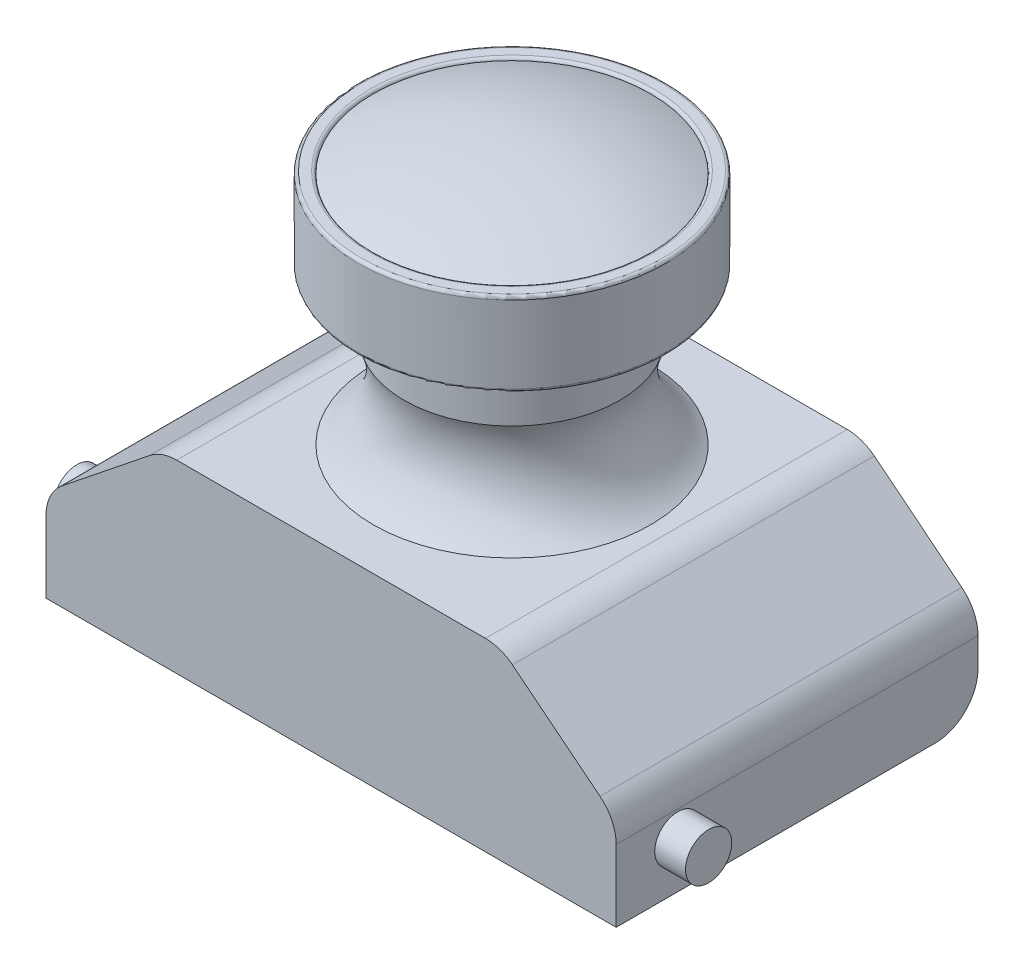
ISO-10303-21;
HEADER;
FILE_DESCRIPTION(('STEP AP214'),'2;1');
FILE_NAME('part.step','',(''),(''),'','','');
FILE_SCHEMA(('AUTOMOTIVE_DESIGN { 1 0 10303 214 1 1 1 1 }'));
ENDSEC;
DATA;
#1=APPLICATION_CONTEXT('core data for automotive mechanical design processes');
#2=APPLICATION_PROTOCOL_DEFINITION('international standard','automotive_design',2000,#1);
#3=PRODUCT_CONTEXT('',#1,'mechanical');
#4=PRODUCT('Part','Part','',(#3));
#5=PRODUCT_RELATED_PRODUCT_CATEGORY('part','',(#4));
#6=PRODUCT_DEFINITION_FORMATION('','',#4);
#7=PRODUCT_DEFINITION_CONTEXT('part definition',#1,'design');
#8=PRODUCT_DEFINITION('design','',#6,#7);
#9=PRODUCT_DEFINITION_SHAPE('','',#8);
#10=(LENGTH_UNIT() NAMED_UNIT(*) SI_UNIT(.MILLI.,.METRE.));
#11=(NAMED_UNIT(*) PLANE_ANGLE_UNIT() SI_UNIT($,.RADIAN.));
#12=(NAMED_UNIT(*) SI_UNIT($,.STERADIAN.) SOLID_ANGLE_UNIT());
#13=UNCERTAINTY_MEASURE_WITH_UNIT(LENGTH_MEASURE(1.E-05),#10,'distance_accuracy_value','');
#14=(GEOMETRIC_REPRESENTATION_CONTEXT(3) GLOBAL_UNCERTAINTY_ASSIGNED_CONTEXT((#13)) GLOBAL_UNIT_ASSIGNED_CONTEXT((#10,
#11,#12)) REPRESENTATION_CONTEXT('',''));
#15=CARTESIAN_POINT('',(0.,0.,0.));
#16=DIRECTION('',(0.,0.,1.));
#17=DIRECTION('',(1.,0.,0.));
#18=AXIS2_PLACEMENT_3D('',#15,#16,#17);
#19=CARTESIAN_POINT('',(-9.25,3.,5.87));
#20=DIRECTION('',(1.,0.,0.));
#21=DIRECTION('',(0.,0.,-1.));
#22=AXIS2_PLACEMENT_3D('',#19,#20,#21);
#23=PLANE('',#22);
#24=CARTESIAN_POINT('',(-9.25,1.5,3.87));
#25=DIRECTION('',(1.,0.,0.));
#26=DIRECTION('',(0.,0.,-1.));
#27=AXIS2_PLACEMENT_3D('',#24,#25,#26);
#28=CIRCLE('',#27,0.75);
#29=CARTESIAN_POINT('',(-9.25,1.5,3.12));
#30=VERTEX_POINT('',#29);
#31=EDGE_CURVE('E182',#30,#30,#28,.F.);
#32=ORIENTED_EDGE('',*,*,#31,.F.);
#33=EDGE_LOOP('',(#32));
#34=FACE_BOUND('',#33,.T.);
#35=DIRECTION('',(0.,-1.,0.));
#36=VECTOR('',#35,1.);
#37=CARTESIAN_POINT('',(-9.25,3.,-5.87));
#38=LINE('',#37,#36);
#39=CARTESIAN_POINT('',(-9.25,2.3271252135188,-5.87));
#40=VERTEX_POINT('',#39);
#41=CARTESIAN_POINT('',(-9.25,1.4,-5.87));
#42=VERTEX_POINT('',#41);
#43=EDGE_CURVE('E274',#40,#42,#38,.T.);
#44=ORIENTED_EDGE('',*,*,#43,.T.);
#45=CARTESIAN_POINT('',(-9.25,1.4,-4.47));
#46=DIRECTION('',(1.,0.,0.));
#47=DIRECTION('',(0.,0.,-1.));
#48=AXIS2_PLACEMENT_3D('',#45,#46,#47);
#49=CIRCLE('',#48,1.4);
#50=CARTESIAN_POINT('',(-9.25,0.,-4.47));
#51=VERTEX_POINT('',#50);
#52=EDGE_CURVE('E160',#42,#51,#49,.F.);
#53=ORIENTED_EDGE('',*,*,#52,.T.);
#54=DIRECTION('',(0.,0.,-1.));
#55=VECTOR('',#54,1.);
#56=CARTESIAN_POINT('',(-9.25,0.,5.87));
#57=LINE('',#56,#55);
#58=CARTESIAN_POINT('',(-9.25,0.,5.87));
#59=VERTEX_POINT('',#58);
#60=EDGE_CURVE('E150',#59,#51,#57,.T.);
#61=ORIENTED_EDGE('',*,*,#60,.F.);
#62=DIRECTION('',(0.,-1.,0.));
#63=VECTOR('',#62,1.);
#64=CARTESIAN_POINT('',(-9.25,3.,5.87));
#65=LINE('',#64,#63);
#66=CARTESIAN_POINT('',(-9.25,2.3271252135188,5.87));
#67=VERTEX_POINT('',#66);
#68=EDGE_CURVE('E130',#67,#59,#65,.T.);
#69=ORIENTED_EDGE('',*,*,#68,.F.);
#70=DIRECTION('',(0.,0.,-1.));
#71=VECTOR('',#70,1.);
#72=CARTESIAN_POINT('',(-9.25,2.3271252135188,5.87));
#73=LINE('',#72,#71);
#74=EDGE_CURVE('E225',#67,#40,#73,.T.);
#75=ORIENTED_EDGE('',*,*,#74,.T.);
#76=EDGE_LOOP('',(#44,#53,#61,#69,#75));
#77=FACE_BOUND('',#76,.T.);
#78=ADVANCED_FACE('F47',(#34,#77),#23,.F.);
#79=CARTESIAN_POINT('',(-9.25,0.,5.87));
#80=DIRECTION('',(0.,1.,0.));
#81=DIRECTION('',(0.,0.,1.));
#82=AXIS2_PLACEMENT_3D('',#79,#80,#81);
#83=PLANE('',#82);
#84=ORIENTED_EDGE('',*,*,#60,.T.);
#85=DIRECTION('',(1.,0.,0.));
#86=VECTOR('',#85,1.);
#87=CARTESIAN_POINT('',(-9.25,0.,-4.47));
#88=LINE('',#87,#86);
#89=CARTESIAN_POINT('',(9.25,0.,-4.47));
#90=VERTEX_POINT('',#89);
#91=EDGE_CURVE('E203',#51,#90,#88,.T.);
#92=ORIENTED_EDGE('',*,*,#91,.T.);
#93=DIRECTION('',(0.,0.,-1.));
#94=VECTOR('',#93,1.);
#95=CARTESIAN_POINT('',(9.25,0.,5.87));
#96=LINE('',#95,#94);
#97=CARTESIAN_POINT('',(9.25,0.,5.87));
#98=VERTEX_POINT('',#97);
#99=EDGE_CURVE('E153',#98,#90,#96,.T.);
#100=ORIENTED_EDGE('',*,*,#99,.F.);
#101=DIRECTION('',(1.,0.,0.));
#102=VECTOR('',#101,1.);
#103=CARTESIAN_POINT('',(-9.25,0.,5.87));
#104=LINE('',#103,#102);
#105=EDGE_CURVE('E134',#59,#98,#104,.T.);
#106=ORIENTED_EDGE('',*,*,#105,.F.);
#107=EDGE_LOOP('',(#84,#92,#100,#106));
#108=FACE_BOUND('',#107,.T.);
#109=ADVANCED_FACE('F148',(#108),#83,.F.);
#110=CARTESIAN_POINT('',(9.25,0.,5.87));
#111=DIRECTION('',(-1.,0.,0.));
#112=DIRECTION('',(0.,0.,1.));
#113=AXIS2_PLACEMENT_3D('',#110,#111,#112);
#114=PLANE('',#113);
#115=CARTESIAN_POINT('',(9.25,1.5,3.87));
#116=DIRECTION('',(-1.,0.,0.));
#117=DIRECTION('',(0.,0.,1.));
#118=AXIS2_PLACEMENT_3D('',#115,#116,#117);
#119=CIRCLE('',#118,0.75);
#120=CARTESIAN_POINT('',(9.25,1.5,4.62));
#121=VERTEX_POINT('',#120);
#122=EDGE_CURVE('E167',#121,#121,#119,.F.);
#123=ORIENTED_EDGE('',*,*,#122,.F.);
#124=EDGE_LOOP('',(#123));
#125=FACE_BOUND('',#124,.T.);
#126=ORIENTED_EDGE('',*,*,#99,.T.);
#127=CARTESIAN_POINT('',(9.25,1.4,-4.47));
#128=DIRECTION('',(-1.,0.,0.));
#129=DIRECTION('',(0.,0.,1.));
#130=AXIS2_PLACEMENT_3D('',#127,#128,#129);
#131=CIRCLE('',#130,1.4);
#132=CARTESIAN_POINT('',(9.25,1.4,-5.87));
#133=VERTEX_POINT('',#132);
#134=EDGE_CURVE('E209',#90,#133,#131,.F.);
#135=ORIENTED_EDGE('',*,*,#134,.T.);
#136=DIRECTION('',(0.,1.,0.));
#137=VECTOR('',#136,1.);
#138=CARTESIAN_POINT('',(9.25,0.,-5.87));
#139=LINE('',#138,#137);
#140=CARTESIAN_POINT('',(9.25,2.3271252135188,-5.87));
#141=VERTEX_POINT('',#140);
#142=EDGE_CURVE('E288',#133,#141,#139,.T.);
#143=ORIENTED_EDGE('',*,*,#142,.T.);
#144=DIRECTION('',(0.,0.,-1.));
#145=VECTOR('',#144,1.);
#146=CARTESIAN_POINT('',(9.25,2.3271252135188,5.87));
#147=LINE('',#146,#145);
#148=CARTESIAN_POINT('',(9.25,2.3271252135188,5.87));
#149=VERTEX_POINT('',#148);
#150=EDGE_CURVE('E206',#141,#149,#147,.F.);
#151=ORIENTED_EDGE('',*,*,#150,.T.);
#152=DIRECTION('',(0.,1.,0.));
#153=VECTOR('',#152,1.);
#154=CARTESIAN_POINT('',(9.25,0.,5.87));
#155=LINE('',#154,#153);
#156=EDGE_CURVE('E156',#98,#149,#155,.T.);
#157=ORIENTED_EDGE('',*,*,#156,.F.);
#158=EDGE_LOOP('',(#126,#135,#143,#151,#157));
#159=FACE_BOUND('',#158,.T.);
#160=ADVANCED_FACE('F314',(#125,#159),#114,.F.);
#161=CARTESIAN_POINT('',(9.25,3.,5.87));
#162=DIRECTION('',(-0.624695047554424,-0.78086880944303,0.));
#163=DIRECTION('',(0.78086880944303,-0.624695047554424,0.));
#164=AXIS2_PLACEMENT_3D('',#161,#162,#163);
#165=PLANE('',#164);
#166=DIRECTION('',(-0.78086880944303,0.624695047554424,0.));
#167=VECTOR('',#166,1.);
#168=CARTESIAN_POINT('',(9.25,3.,-5.87));
#169=LINE('',#168,#167);
#170=CARTESIAN_POINT('',(8.72457306657619,3.42034154673904,-5.87));
#171=VERTEX_POINT('',#170);
#172=CARTESIAN_POINT('',(5.8834795834747,5.69321633322024,-5.87));
#173=VERTEX_POINT('',#172);
#174=EDGE_CURVE('E292',#171,#173,#169,.T.);
#175=ORIENTED_EDGE('',*,*,#174,.T.);
#176=DIRECTION('',(0.,0.,-1.));
#177=VECTOR('',#176,1.);
#178=CARTESIAN_POINT('',(5.8834795834747,5.69321633322024,5.87));
#179=LINE('',#178,#177);
#180=CARTESIAN_POINT('',(5.8834795834747,5.69321633322024,5.87));
#181=VERTEX_POINT('',#180);
#182=EDGE_CURVE('E56',#173,#181,#179,.F.);
#183=ORIENTED_EDGE('',*,*,#182,.T.);
#184=DIRECTION('',(-0.78086880944303,0.624695047554424,0.));
#185=VECTOR('',#184,1.);
#186=CARTESIAN_POINT('',(9.25,3.,5.87));
#187=LINE('',#186,#185);
#188=CARTESIAN_POINT('',(8.72457306657619,3.42034154673904,5.87));
#189=VERTEX_POINT('',#188);
#190=EDGE_CURVE('E278',#189,#181,#187,.T.);
#191=ORIENTED_EDGE('',*,*,#190,.F.);
#192=DIRECTION('',(0.,0.,-1.));
#193=VECTOR('',#192,1.);
#194=CARTESIAN_POINT('',(8.72457306657619,3.42034154673905,5.87));
#195=LINE('',#194,#193);
#196=EDGE_CURVE('E230',#189,#171,#195,.T.);
#197=ORIENTED_EDGE('',*,*,#196,.T.);
#198=EDGE_LOOP('',(#175,#183,#191,#197));
#199=FACE_BOUND('',#198,.T.);
#200=ADVANCED_FACE('F320',(#199),#165,.F.);
#201=CARTESIAN_POINT('',(5.5,6.,5.87));
#202=DIRECTION('',(0.,-1.,0.));
#203=DIRECTION('',(0.,0.,-1.));
#204=AXIS2_PLACEMENT_3D('',#201,#202,#203);
#205=PLANE('',#204);
#206=CARTESIAN_POINT('',(0.,6.,0.));
#207=DIRECTION('',(0.,1.,0.));
#208=DIRECTION('',(0.,0.,1.));
#209=AXIS2_PLACEMENT_3D('',#206,#207,#208);
#210=CIRCLE('',#209,4.5);
#211=CARTESIAN_POINT('',(0.,6.,4.5));
#212=VERTEX_POINT('',#211);
#213=EDGE_CURVE('E162',#212,#212,#210,.T.);
#214=ORIENTED_EDGE('',*,*,#213,.F.);
#215=EDGE_LOOP('',(#214));
#216=FACE_BOUND('',#215,.T.);
#217=DIRECTION('',(-1.,0.,0.));
#218=VECTOR('',#217,1.);
#219=CARTESIAN_POINT('',(5.5,6.,5.87));
#220=LINE('',#219,#218);
#221=CARTESIAN_POINT('',(5.0089065168985,6.,5.87));
#222=VERTEX_POINT('',#221);
#223=CARTESIAN_POINT('',(-5.0089065168985,6.,5.87));
#224=VERTEX_POINT('',#223);
#225=EDGE_CURVE('E281',#222,#224,#220,.T.);
#226=ORIENTED_EDGE('',*,*,#225,.F.);
#227=DIRECTION('',(0.,0.,-1.));
#228=VECTOR('',#227,1.);
#229=CARTESIAN_POINT('',(5.0089065168985,6.,5.87));
#230=LINE('',#229,#228);
#231=CARTESIAN_POINT('',(5.0089065168985,6.,-5.87));
#232=VERTEX_POINT('',#231);
#233=EDGE_CURVE('E253',#222,#232,#230,.T.);
#234=ORIENTED_EDGE('',*,*,#233,.T.);
#235=DIRECTION('',(-1.,0.,0.));
#236=VECTOR('',#235,1.);
#237=CARTESIAN_POINT('',(5.5,6.,-5.87));
#238=LINE('',#237,#236);
#239=CARTESIAN_POINT('',(-5.0089065168985,6.,-5.87));
#240=VERTEX_POINT('',#239);
#241=EDGE_CURVE('E295',#232,#240,#238,.T.);
#242=ORIENTED_EDGE('',*,*,#241,.T.);
#243=DIRECTION('',(0.,0.,-1.));
#244=VECTOR('',#243,1.);
#245=CARTESIAN_POINT('',(-5.0089065168985,6.,5.87));
#246=LINE('',#245,#244);
#247=EDGE_CURVE('E249',#240,#224,#246,.F.);
#248=ORIENTED_EDGE('',*,*,#247,.T.);
#249=EDGE_LOOP('',(#226,#234,#242,#248));
#250=FACE_BOUND('',#249,.T.);
#251=ADVANCED_FACE('F326',(#216,#250),#205,.F.);
#252=CARTESIAN_POINT('',(-5.5,6.,5.87));
#253=DIRECTION('',(0.624695047554424,-0.78086880944303,0.));
#254=DIRECTION('',(0.78086880944303,0.624695047554424,0.));
#255=AXIS2_PLACEMENT_3D('',#252,#253,#254);
#256=PLANE('',#255);
#257=DIRECTION('',(-0.78086880944303,-0.624695047554424,0.));
#258=VECTOR('',#257,1.);
#259=CARTESIAN_POINT('',(-5.5,6.,-5.87));
#260=LINE('',#259,#258);
#261=CARTESIAN_POINT('',(-5.8834795834747,5.69321633322024,-5.87));
#262=VERTEX_POINT('',#261);
#263=CARTESIAN_POINT('',(-8.72457306657619,3.42034154673905,-5.87));
#264=VERTEX_POINT('',#263);
#265=EDGE_CURVE('E144',#262,#264,#260,.T.);
#266=ORIENTED_EDGE('',*,*,#265,.T.);
#267=DIRECTION('',(0.,0.,-1.));
#268=VECTOR('',#267,1.);
#269=CARTESIAN_POINT('',(-8.72457306657619,3.42034154673905,5.87));
#270=LINE('',#269,#268);
#271=CARTESIAN_POINT('',(-8.72457306657619,3.42034154673905,5.87));
#272=VERTEX_POINT('',#271);
#273=EDGE_CURVE('E246',#264,#272,#270,.F.);
#274=ORIENTED_EDGE('',*,*,#273,.T.);
#275=DIRECTION('',(-0.78086880944303,-0.624695047554424,0.));
#276=VECTOR('',#275,1.);
#277=CARTESIAN_POINT('',(-5.5,6.,5.87));
#278=LINE('',#277,#276);
#279=CARTESIAN_POINT('',(-5.8834795834747,5.69321633322024,5.87));
#280=VERTEX_POINT('',#279);
#281=EDGE_CURVE('E169',#280,#272,#278,.T.);
#282=ORIENTED_EDGE('',*,*,#281,.F.);
#283=DIRECTION('',(0.,0.,-1.));
#284=VECTOR('',#283,1.);
#285=CARTESIAN_POINT('',(-5.8834795834747,5.69321633322024,5.87));
#286=LINE('',#285,#284);
#287=EDGE_CURVE('E242',#280,#262,#286,.T.);
#288=ORIENTED_EDGE('',*,*,#287,.T.);
#289=EDGE_LOOP('',(#266,#274,#282,#288));
#290=FACE_BOUND('',#289,.T.);
#291=ADVANCED_FACE('F302',(#290),#256,.F.);
#292=CARTESIAN_POINT('',(0.,0.,5.87));
#293=DIRECTION('',(0.,0.,1.));
#294=DIRECTION('',(1.,0.,0.));
#295=AXIS2_PLACEMENT_3D('',#292,#293,#294);
#296=PLANE('',#295);
#297=ORIENTED_EDGE('',*,*,#190,.T.);
#298=CARTESIAN_POINT('',(5.0089065168985,4.6,5.87));
#299=DIRECTION('',(0.,0.,1.));
#300=DIRECTION('',(1.,0.,0.));
#301=AXIS2_PLACEMENT_3D('',#298,#299,#300);
#302=CIRCLE('',#301,1.4);
#303=EDGE_CURVE('E11',#181,#222,#302,.T.);
#304=ORIENTED_EDGE('',*,*,#303,.T.);
#305=ORIENTED_EDGE('',*,*,#225,.T.);
#306=CARTESIAN_POINT('',(-5.0089065168985,4.6,5.87));
#307=DIRECTION('',(0.,0.,1.));
#308=DIRECTION('',(1.,0.,0.));
#309=AXIS2_PLACEMENT_3D('',#306,#307,#308);
#310=CIRCLE('',#309,1.4);
#311=EDGE_CURVE('E234',#224,#280,#310,.T.);
#312=ORIENTED_EDGE('',*,*,#311,.T.);
#313=ORIENTED_EDGE('',*,*,#281,.T.);
#314=CARTESIAN_POINT('',(-7.85,2.3271252135188,5.87));
#315=DIRECTION('',(0.,0.,1.));
#316=DIRECTION('',(1.,0.,0.));
#317=AXIS2_PLACEMENT_3D('',#314,#315,#316);
#318=CIRCLE('',#317,1.4);
#319=EDGE_CURVE('E138',#272,#67,#318,.T.);
#320=ORIENTED_EDGE('',*,*,#319,.T.);
#321=ORIENTED_EDGE('',*,*,#68,.T.);
#322=ORIENTED_EDGE('',*,*,#105,.T.);
#323=ORIENTED_EDGE('',*,*,#156,.T.);
#324=CARTESIAN_POINT('',(7.85,2.3271252135188,5.87));
#325=DIRECTION('',(0.,0.,1.));
#326=DIRECTION('',(1.,0.,0.));
#327=AXIS2_PLACEMENT_3D('',#324,#325,#326);
#328=CIRCLE('',#327,1.4);
#329=EDGE_CURVE('E239',#149,#189,#328,.T.);
#330=ORIENTED_EDGE('',*,*,#329,.T.);
#331=EDGE_LOOP('',(#297,#304,#305,#312,#313,#320,#321,#322,#323,#330));
#332=FACE_BOUND('',#331,.T.);
#333=ADVANCED_FACE('F132',(#332),#296,.T.);
#334=CARTESIAN_POINT('',(0.,0.,-5.87));
#335=DIRECTION('',(0.,0.,1.));
#336=DIRECTION('',(1.,0.,0.));
#337=AXIS2_PLACEMENT_3D('',#334,#335,#336);
#338=PLANE('',#337);
#339=ORIENTED_EDGE('',*,*,#241,.F.);
#340=CARTESIAN_POINT('',(5.0089065168985,4.6,-5.87));
#341=DIRECTION('',(0.,0.,1.));
#342=DIRECTION('',(1.,0.,0.));
#343=AXIS2_PLACEMENT_3D('',#340,#341,#342);
#344=CIRCLE('',#343,1.4);
#345=EDGE_CURVE('E70',#232,#173,#344,.F.);
#346=ORIENTED_EDGE('',*,*,#345,.T.);
#347=ORIENTED_EDGE('',*,*,#174,.F.);
#348=CARTESIAN_POINT('',(7.85,2.3271252135188,-5.87));
#349=DIRECTION('',(0.,0.,1.));
#350=DIRECTION('',(1.,0.,0.));
#351=AXIS2_PLACEMENT_3D('',#348,#349,#350);
#352=CIRCLE('',#351,1.4);
#353=EDGE_CURVE('E219',#171,#141,#352,.F.);
#354=ORIENTED_EDGE('',*,*,#353,.T.);
#355=ORIENTED_EDGE('',*,*,#142,.F.);
#356=DIRECTION('',(1.,0.,0.));
#357=VECTOR('',#356,1.);
#358=CARTESIAN_POINT('',(0.,1.4,-5.87));
#359=LINE('',#358,#357);
#360=EDGE_CURVE('E222',#133,#42,#359,.F.);
#361=ORIENTED_EDGE('',*,*,#360,.T.);
#362=ORIENTED_EDGE('',*,*,#43,.F.);
#363=CARTESIAN_POINT('',(-7.85,2.3271252135188,-5.87));
#364=DIRECTION('',(0.,0.,1.));
#365=DIRECTION('',(1.,0.,0.));
#366=AXIS2_PLACEMENT_3D('',#363,#364,#365);
#367=CIRCLE('',#366,1.4);
#368=EDGE_CURVE('E216',#40,#264,#367,.F.);
#369=ORIENTED_EDGE('',*,*,#368,.T.);
#370=ORIENTED_EDGE('',*,*,#265,.F.);
#371=CARTESIAN_POINT('',(-5.0089065168985,4.6,-5.87));
#372=DIRECTION('',(0.,0.,1.));
#373=DIRECTION('',(1.,0.,0.));
#374=AXIS2_PLACEMENT_3D('',#371,#372,#373);
#375=CIRCLE('',#374,1.4);
#376=EDGE_CURVE('E212',#262,#240,#375,.F.);
#377=ORIENTED_EDGE('',*,*,#376,.T.);
#378=EDGE_LOOP('',(#339,#346,#347,#354,#355,#361,#362,#369,#370,#377));
#379=FACE_BOUND('',#378,.T.);
#380=ADVANCED_FACE('F308',(#379),#338,.F.);
#381=CARTESIAN_POINT('',(0.,8.11237243569579,0.));
#382=DIRECTION('',(0.,1.,0.));
#383=DIRECTION('',(0.,0.,1.));
#384=AXIS2_PLACEMENT_3D('',#381,#382,#383);
#385=TOROIDAL_SURFACE('',#384,5.83711730708738,2.5);
#386=ORIENTED_EDGE('',*,*,#213,.T.);
#387=EDGE_LOOP('',(#386));
#388=FACE_BOUND('',#387,.T.);
#389=CARTESIAN_POINT('',(0.,9.,0.));
#390=DIRECTION('',(0.,1.,0.));
#391=DIRECTION('',(0.,0.,1.));
#392=AXIS2_PLACEMENT_3D('',#389,#390,#391);
#393=CIRCLE('',#392,3.5);
#394=CARTESIAN_POINT('',(0.,9.,3.5));
#395=VERTEX_POINT('',#394);
#396=EDGE_CURVE('E271',#395,#395,#393,.T.);
#397=ORIENTED_EDGE('',*,*,#396,.F.);
#398=EDGE_LOOP('',(#397));
#399=FACE_BOUND('',#398,.T.);
#400=ADVANCED_FACE('F418',(#388,#399),#385,.F.);
#401=CARTESIAN_POINT('',(0.,13.5,0.));
#402=DIRECTION('',(0.,1.,0.));
#403=DIRECTION('',(0.,0.,1.));
#404=AXIS2_PLACEMENT_3D('',#401,#402,#403);
#405=CYLINDRICAL_SURFACE('',#404,3.5);
#406=ORIENTED_EDGE('',*,*,#396,.T.);
#407=EDGE_LOOP('',(#406));
#408=FACE_BOUND('',#407,.T.);
#409=CARTESIAN_POINT('',(0.,11.,0.));
#410=DIRECTION('',(0.,1.,0.));
#411=DIRECTION('',(0.,0.,1.));
#412=AXIS2_PLACEMENT_3D('',#409,#410,#411);
#413=CIRCLE('',#412,3.5);
#414=CARTESIAN_POINT('',(0.,11.,3.5));
#415=VERTEX_POINT('',#414);
#416=EDGE_CURVE('E177',#415,#415,#413,.T.);
#417=ORIENTED_EDGE('',*,*,#416,.F.);
#418=EDGE_LOOP('',(#417));
#419=FACE_BOUND('',#418,.T.);
#420=ADVANCED_FACE('F535',(#408,#419),#405,.T.);
#421=CARTESIAN_POINT('',(0.,11.,0.));
#422=DIRECTION('',(0.,-1.,0.));
#423=DIRECTION('',(0.,0.,-1.));
#424=AXIS2_PLACEMENT_3D('',#421,#422,#423);
#425=PLANE('',#424);
#426=CARTESIAN_POINT('',(0.,11.,0.));
#427=DIRECTION('',(0.,-1.,0.));
#428=DIRECTION('',(0.,0.,-1.));
#429=AXIS2_PLACEMENT_3D('',#426,#427,#428);
#430=CIRCLE('',#429,4.9);
#431=CARTESIAN_POINT('',(0.,11.,-4.9));
#432=VERTEX_POINT('',#431);
#433=EDGE_CURVE('E199',#432,#432,#430,.T.);
#434=ORIENTED_EDGE('',*,*,#433,.T.);
#435=EDGE_LOOP('',(#434));
#436=FACE_BOUND('',#435,.T.);
#437=ORIENTED_EDGE('',*,*,#416,.T.);
#438=EDGE_LOOP('',(#437));
#439=FACE_BOUND('',#438,.T.);
#440=ADVANCED_FACE('F525',(#436,#439),#425,.T.);
#441=CARTESIAN_POINT('',(0.,13.5,0.));
#442=DIRECTION('',(0.,1.,0.));
#443=DIRECTION('',(0.,0.,1.));
#444=AXIS2_PLACEMENT_3D('',#441,#442,#443);
#445=CYLINDRICAL_SURFACE('',#444,5.);
#446=CARTESIAN_POINT('',(0.,13.6,0.));
#447=DIRECTION('',(0.,1.,0.));
#448=DIRECTION('',(0.,0.,1.));
#449=AXIS2_PLACEMENT_3D('',#446,#447,#448);
#450=CIRCLE('',#449,5.);
#451=CARTESIAN_POINT('',(0.,13.6,5.));
#452=VERTEX_POINT('',#451);
#453=EDGE_CURVE('E195',#452,#452,#450,.F.);
#454=ORIENTED_EDGE('',*,*,#453,.T.);
#455=EDGE_LOOP('',(#454));
#456=FACE_BOUND('',#455,.T.);
#457=CARTESIAN_POINT('',(0.,11.1,0.));
#458=DIRECTION('',(0.,-1.,0.));
#459=DIRECTION('',(0.,0.,-1.));
#460=AXIS2_PLACEMENT_3D('',#457,#458,#459);
#461=CIRCLE('',#460,5.);
#462=CARTESIAN_POINT('',(0.,11.1,-5.));
#463=VERTEX_POINT('',#462);
#464=EDGE_CURVE('E191',#463,#463,#461,.F.);
#465=ORIENTED_EDGE('',*,*,#464,.T.);
#466=EDGE_LOOP('',(#465));
#467=FACE_BOUND('',#466,.T.);
#468=ADVANCED_FACE('F515',(#456,#467),#445,.T.);
#469=CARTESIAN_POINT('',(0.,13.7,0.));
#470=DIRECTION('',(0.,1.,0.));
#471=DIRECTION('',(0.,0.,1.));
#472=AXIS2_PLACEMENT_3D('',#469,#470,#471);
#473=PLANE('',#472);
#474=CARTESIAN_POINT('',(0.,13.7,0.));
#475=DIRECTION('',(0.,1.,0.));
#476=DIRECTION('',(0.,0.,1.));
#477=AXIS2_PLACEMENT_3D('',#474,#475,#476);
#478=CIRCLE('',#477,4.59932915004422);
#479=CARTESIAN_POINT('',(0.,13.7,4.59932915004422));
#480=VERTEX_POINT('',#479);
#481=EDGE_CURVE('E187',#480,#480,#478,.F.);
#482=ORIENTED_EDGE('',*,*,#481,.T.);
#483=EDGE_LOOP('',(#482));
#484=FACE_BOUND('',#483,.T.);
#485=CARTESIAN_POINT('',(0.,13.7,0.));
#486=DIRECTION('',(0.,1.,0.));
#487=DIRECTION('',(0.,0.,1.));
#488=AXIS2_PLACEMENT_3D('',#485,#486,#487);
#489=CIRCLE('',#488,4.9);
#490=CARTESIAN_POINT('',(0.,13.7,4.9));
#491=VERTEX_POINT('',#490);
#492=EDGE_CURVE('E183',#491,#491,#489,.T.);
#493=ORIENTED_EDGE('',*,*,#492,.T.);
#494=EDGE_LOOP('',(#493));
#495=FACE_BOUND('',#494,.T.);
#496=ADVANCED_FACE('F505',(#484,#495),#473,.T.);
#497=CARTESIAN_POINT('',(0.,3.19175087611868,0.));
#498=DIRECTION('',(0.,1.,0.));
#499=DIRECTION('',(1.,0.,0.));
#500=AXIS2_PLACEMENT_3D('',#497,#498,#499);
#501=SPHERICAL_SURFACE('',#500,11.35);
#502=CARTESIAN_POINT('',(0.,13.611563734323,0.));
#503=DIRECTION('',(0.,-1.,0.));
#504=DIRECTION('',(0.,0.,-1.));
#505=AXIS2_PLACEMENT_3D('',#502,#503,#504);
#506=CIRCLE('',#505,4.5);
#507=CARTESIAN_POINT('',(0.,13.611563734323,-4.5));
#508=VERTEX_POINT('',#507);
#509=EDGE_CURVE('E173',#508,#508,#506,.T.);
#510=ORIENTED_EDGE('',*,*,#509,.F.);
#511=EDGE_LOOP('',(#510));
#512=FACE_BOUND('',#511,.T.);
#513=ADVANCED_FACE('F495',(#512),#501,.T.);
#514=CARTESIAN_POINT('',(10.25,1.5,3.87));
#515=DIRECTION('',(-1.,0.,0.));
#516=DIRECTION('',(0.,0.,1.));
#517=AXIS2_PLACEMENT_3D('',#514,#515,#516);
#518=PLANE('',#517);
#519=CARTESIAN_POINT('',(10.25,1.5,3.87));
#520=DIRECTION('',(-1.,0.,0.));
#521=DIRECTION('',(0.,0.,1.));
#522=AXIS2_PLACEMENT_3D('',#519,#520,#521);
#523=CIRCLE('',#522,0.75);
#524=CARTESIAN_POINT('',(10.25,1.5,4.62));
#525=VERTEX_POINT('',#524);
#526=EDGE_CURVE('E265',#525,#525,#523,.T.);
#527=ORIENTED_EDGE('',*,*,#526,.F.);
#528=EDGE_LOOP('',(#527));
#529=FACE_BOUND('',#528,.T.);
#530=ADVANCED_FACE('F486',(#529),#518,.F.);
#531=CARTESIAN_POINT('',(-10.25,1.5,3.87));
#532=DIRECTION('',(1.,0.,0.));
#533=DIRECTION('',(0.,0.,-1.));
#534=AXIS2_PLACEMENT_3D('',#531,#532,#533);
#535=CYLINDRICAL_SURFACE('',#534,0.75);
#536=ORIENTED_EDGE('',*,*,#526,.T.);
#537=EDGE_LOOP('',(#536));
#538=FACE_BOUND('',#537,.T.);
#539=ORIENTED_EDGE('',*,*,#122,.T.);
#540=EDGE_LOOP('',(#539));
#541=FACE_BOUND('',#540,.T.);
#542=ADVANCED_FACE('F476',(#538,#541),#535,.T.);
#543=CARTESIAN_POINT('',(-10.25,1.5,3.87));
#544=DIRECTION('',(-1.,0.,0.));
#545=DIRECTION('',(0.,0.,1.));
#546=AXIS2_PLACEMENT_3D('',#543,#544,#545);
#547=CIRCLE('',#546,0.75);
#548=CARTESIAN_POINT('',(-10.25,1.5,4.62));
#549=VERTEX_POINT('',#548);
#550=EDGE_CURVE('E178',#549,#549,#547,.T.);
#551=ORIENTED_EDGE('',*,*,#550,.F.);
#552=EDGE_LOOP('',(#551));
#553=FACE_BOUND('',#552,.T.);
#554=ORIENTED_EDGE('',*,*,#31,.T.);
#555=EDGE_LOOP('',(#554));
#556=FACE_BOUND('',#555,.T.);
#557=ADVANCED_FACE('F466',(#553,#556),#535,.T.);
#558=CARTESIAN_POINT('',(-10.25,1.5,3.87));
#559=DIRECTION('',(-1.,0.,0.));
#560=DIRECTION('',(0.,0.,1.));
#561=AXIS2_PLACEMENT_3D('',#558,#559,#560);
#562=PLANE('',#561);
#563=ORIENTED_EDGE('',*,*,#550,.T.);
#564=EDGE_LOOP('',(#563));
#565=FACE_BOUND('',#564,.T.);
#566=ADVANCED_FACE('F350',(#565),#562,.T.);
#567=CARTESIAN_POINT('',(0.,13.6,0.));
#568=DIRECTION('',(0.,1.,0.));
#569=DIRECTION('',(0.,0.,1.));
#570=AXIS2_PLACEMENT_3D('',#567,#568,#569);
#571=TOROIDAL_SURFACE('',#570,4.59932915004422,0.1);
#572=ORIENTED_EDGE('',*,*,#481,.F.);
#573=EDGE_LOOP('',(#572));
#574=FACE_BOUND('',#573,.T.);
#575=ORIENTED_EDGE('',*,*,#509,.T.);
#576=EDGE_LOOP('',(#575));
#577=FACE_BOUND('',#576,.T.);
#578=ADVANCED_FACE('F346',(#574,#577),#571,.T.);
#579=CARTESIAN_POINT('',(0.,13.6,0.));
#580=DIRECTION('',(0.,1.,0.));
#581=DIRECTION('',(0.,0.,1.));
#582=AXIS2_PLACEMENT_3D('',#579,#580,#581);
#583=TOROIDAL_SURFACE('',#582,4.9,0.1);
#584=ORIENTED_EDGE('',*,*,#453,.F.);
#585=EDGE_LOOP('',(#584));
#586=FACE_BOUND('',#585,.T.);
#587=ORIENTED_EDGE('',*,*,#492,.F.);
#588=EDGE_LOOP('',(#587));
#589=FACE_BOUND('',#588,.T.);
#590=ADVANCED_FACE('F349',(#586,#589),#583,.T.);
#591=CARTESIAN_POINT('',(0.,11.1,0.));
#592=DIRECTION('',(0.,-1.,0.));
#593=DIRECTION('',(0.,0.,-1.));
#594=AXIS2_PLACEMENT_3D('',#591,#592,#593);
#595=TOROIDAL_SURFACE('',#594,4.9,0.1);
#596=ORIENTED_EDGE('',*,*,#433,.F.);
#597=EDGE_LOOP('',(#596));
#598=FACE_BOUND('',#597,.T.);
#599=ORIENTED_EDGE('',*,*,#464,.F.);
#600=EDGE_LOOP('',(#599));
#601=FACE_BOUND('',#600,.T.);
#602=ADVANCED_FACE('F354',(#598,#601),#595,.T.);
#603=CARTESIAN_POINT('',(-9.25,1.4,-4.47));
#604=DIRECTION('',(1.,0.,0.));
#605=DIRECTION('',(0.,0.,-1.));
#606=AXIS2_PLACEMENT_3D('',#603,#604,#605);
#607=CYLINDRICAL_SURFACE('',#606,1.4);
#608=ORIENTED_EDGE('',*,*,#52,.F.);
#609=ORIENTED_EDGE('',*,*,#360,.F.);
#610=ORIENTED_EDGE('',*,*,#134,.F.);
#611=ORIENTED_EDGE('',*,*,#91,.F.);
#612=EDGE_LOOP('',(#608,#609,#610,#611));
#613=FACE_BOUND('',#612,.T.);
#614=ADVANCED_FACE('F312',(#613),#607,.T.);
#615=CARTESIAN_POINT('',(7.85,2.3271252135188,5.87));
#616=DIRECTION('',(0.,0.,-1.));
#617=DIRECTION('',(-1.,0.,0.));
#618=AXIS2_PLACEMENT_3D('',#615,#616,#617);
#619=CYLINDRICAL_SURFACE('',#618,1.4);
#620=ORIENTED_EDGE('',*,*,#329,.F.);
#621=ORIENTED_EDGE('',*,*,#150,.F.);
#622=ORIENTED_EDGE('',*,*,#353,.F.);
#623=ORIENTED_EDGE('',*,*,#196,.F.);
#624=EDGE_LOOP('',(#620,#621,#622,#623));
#625=FACE_BOUND('',#624,.T.);
#626=ADVANCED_FACE('F319',(#625),#619,.T.);
#627=CARTESIAN_POINT('',(-7.85,2.3271252135188,5.87));
#628=DIRECTION('',(0.,0.,-1.));
#629=DIRECTION('',(-1.,0.,0.));
#630=AXIS2_PLACEMENT_3D('',#627,#628,#629);
#631=CYLINDRICAL_SURFACE('',#630,1.4);
#632=ORIENTED_EDGE('',*,*,#319,.F.);
#633=ORIENTED_EDGE('',*,*,#273,.F.);
#634=ORIENTED_EDGE('',*,*,#368,.F.);
#635=ORIENTED_EDGE('',*,*,#74,.F.);
#636=EDGE_LOOP('',(#632,#633,#634,#635));
#637=FACE_BOUND('',#636,.T.);
#638=ADVANCED_FACE('F306',(#637),#631,.T.);
#639=CARTESIAN_POINT('',(-5.0089065168985,4.6,5.87));
#640=DIRECTION('',(0.,0.,-1.));
#641=DIRECTION('',(-1.,0.,0.));
#642=AXIS2_PLACEMENT_3D('',#639,#640,#641);
#643=CYLINDRICAL_SURFACE('',#642,1.4);
#644=ORIENTED_EDGE('',*,*,#311,.F.);
#645=ORIENTED_EDGE('',*,*,#247,.F.);
#646=ORIENTED_EDGE('',*,*,#376,.F.);
#647=ORIENTED_EDGE('',*,*,#287,.F.);
#648=EDGE_LOOP('',(#644,#645,#646,#647));
#649=FACE_BOUND('',#648,.T.);
#650=ADVANCED_FACE('F330',(#649),#643,.T.);
#651=CARTESIAN_POINT('',(5.0089065168985,4.6,5.87));
#652=DIRECTION('',(0.,0.,-1.));
#653=DIRECTION('',(-1.,0.,0.));
#654=AXIS2_PLACEMENT_3D('',#651,#652,#653);
#655=CYLINDRICAL_SURFACE('',#654,1.4);
#656=ORIENTED_EDGE('',*,*,#303,.F.);
#657=ORIENTED_EDGE('',*,*,#182,.F.);
#658=ORIENTED_EDGE('',*,*,#345,.F.);
#659=ORIENTED_EDGE('',*,*,#233,.F.);
#660=EDGE_LOOP('',(#656,#657,#658,#659));
#661=FACE_BOUND('',#660,.T.);
#662=ADVANCED_FACE('F49',(#661),#655,.T.);
#663=CLOSED_SHELL('',(#78,#109,#160,#200,#251,#291,#333,#380,#400,#420,#440,#468,#496,#513,#530,
#542,#557,#566,#578,#590,#602,#614,#626,#638,#650,#662));
#664=MANIFOLD_SOLID_BREP('B2',#663);
#665=ADVANCED_BREP_SHAPE_REPRESENTATION('',(#18,#664),#14);
#666=SHAPE_DEFINITION_REPRESENTATION(#9,#665);
ENDSEC;
END-ISO-10303-21;
